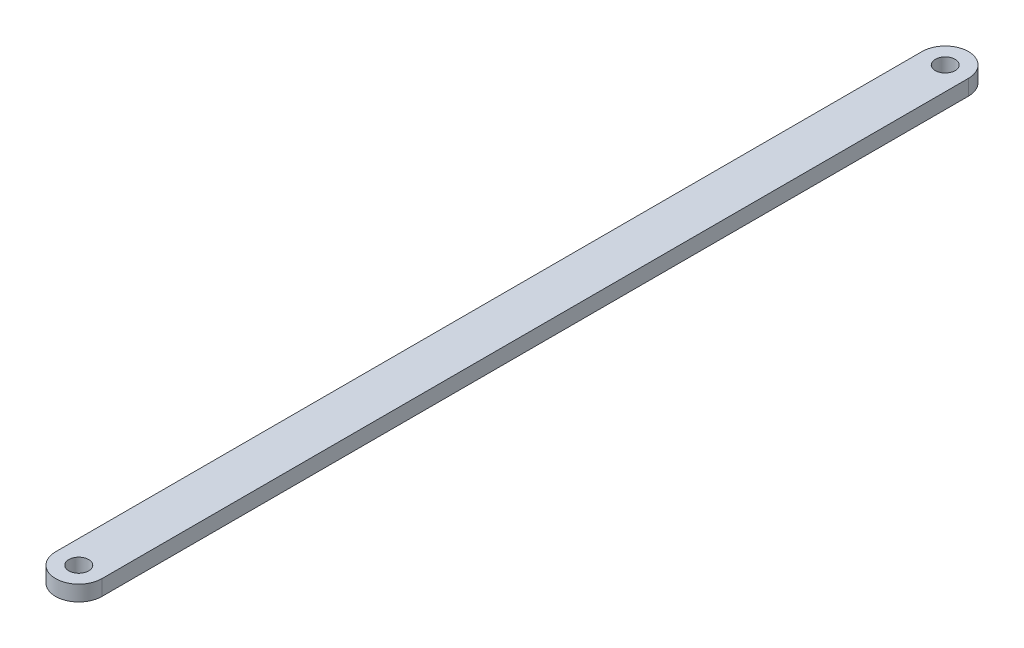
ISO-10303-21;
HEADER;
FILE_DESCRIPTION(('STEP AP214'),'2;1');
FILE_NAME('part.step','',(''),(''),'','','');
FILE_SCHEMA(('AUTOMOTIVE_DESIGN { 1 0 10303 214 1 1 1 1 }'));
ENDSEC;
DATA;
#1=APPLICATION_CONTEXT('core data for automotive mechanical design processes');
#2=APPLICATION_PROTOCOL_DEFINITION('international standard','automotive_design',2000,#1);
#3=PRODUCT_CONTEXT('',#1,'mechanical');
#4=PRODUCT('Part','Part','',(#3));
#5=PRODUCT_RELATED_PRODUCT_CATEGORY('part','',(#4));
#6=PRODUCT_DEFINITION_FORMATION('','',#4);
#7=PRODUCT_DEFINITION_CONTEXT('part definition',#1,'design');
#8=PRODUCT_DEFINITION('design','',#6,#7);
#9=PRODUCT_DEFINITION_SHAPE('','',#8);
#10=(LENGTH_UNIT() NAMED_UNIT(*) SI_UNIT(.MILLI.,.METRE.));
#11=(NAMED_UNIT(*) PLANE_ANGLE_UNIT() SI_UNIT($,.RADIAN.));
#12=(NAMED_UNIT(*) SI_UNIT($,.STERADIAN.) SOLID_ANGLE_UNIT());
#13=UNCERTAINTY_MEASURE_WITH_UNIT(LENGTH_MEASURE(1.E-05),#10,'distance_accuracy_value','');
#14=(GEOMETRIC_REPRESENTATION_CONTEXT(3) GLOBAL_UNCERTAINTY_ASSIGNED_CONTEXT((#13)) GLOBAL_UNIT_ASSIGNED_CONTEXT((#10,
#11,#12)) REPRESENTATION_CONTEXT('',''));
#15=CARTESIAN_POINT('',(0.,0.,0.));
#16=DIRECTION('',(0.,0.,1.));
#17=DIRECTION('',(1.,0.,0.));
#18=AXIS2_PLACEMENT_3D('',#15,#16,#17);
#19=CARTESIAN_POINT('',(0.,3.175,0.));
#20=DIRECTION('',(0.,1.,0.));
#21=DIRECTION('',(0.,0.,1.));
#22=AXIS2_PLACEMENT_3D('',#19,#20,#21);
#23=PLANE('',#22);
#24=CARTESIAN_POINT('',(0.,3.175,-177.8));
#25=DIRECTION('',(0.,1.,0.));
#26=DIRECTION('',(0.,0.,1.));
#27=AXIS2_PLACEMENT_3D('',#24,#25,#26);
#28=CIRCLE('',#27,2.03199999999999);
#29=CARTESIAN_POINT('',(0.,3.175,-175.768));
#30=VERTEX_POINT('',#29);
#31=EDGE_CURVE('E120',#30,#30,#28,.T.);
#32=ORIENTED_EDGE('',*,*,#31,.F.);
#33=EDGE_LOOP('',(#32));
#34=FACE_BOUND('',#33,.T.);
#35=CARTESIAN_POINT('',(0.,3.175,0.));
#36=DIRECTION('',(0.,1.,0.));
#37=DIRECTION('',(0.,0.,1.));
#38=AXIS2_PLACEMENT_3D('',#35,#36,#37);
#39=CIRCLE('',#38,4.7625);
#40=CARTESIAN_POINT('',(-4.7625,3.175,0.));
#41=VERTEX_POINT('',#40);
#42=CARTESIAN_POINT('',(4.7625,3.175,0.));
#43=VERTEX_POINT('',#42);
#44=EDGE_CURVE('E99',#41,#43,#39,.T.);
#45=ORIENTED_EDGE('',*,*,#44,.T.);
#46=DIRECTION('',(0.,0.,-1.));
#47=VECTOR('',#46,1.);
#48=CARTESIAN_POINT('',(4.7625,3.175,0.));
#49=LINE('',#48,#47);
#50=CARTESIAN_POINT('',(4.7625,3.175,-177.8));
#51=VERTEX_POINT('',#50);
#52=EDGE_CURVE('E94',#43,#51,#49,.T.);
#53=ORIENTED_EDGE('',*,*,#52,.T.);
#54=CARTESIAN_POINT('',(0.,3.175,-177.8));
#55=DIRECTION('',(0.,1.,0.));
#56=DIRECTION('',(0.,0.,1.));
#57=AXIS2_PLACEMENT_3D('',#54,#55,#56);
#58=CIRCLE('',#57,4.7625);
#59=CARTESIAN_POINT('',(-4.7625,3.175,-177.8));
#60=VERTEX_POINT('',#59);
#61=EDGE_CURVE('E97',#51,#60,#58,.T.);
#62=ORIENTED_EDGE('',*,*,#61,.T.);
#63=DIRECTION('',(0.,0.,1.));
#64=VECTOR('',#63,1.);
#65=CARTESIAN_POINT('',(-4.7625,3.175,0.));
#66=LINE('',#65,#64);
#67=EDGE_CURVE('E60',#60,#41,#66,.T.);
#68=ORIENTED_EDGE('',*,*,#67,.T.);
#69=EDGE_LOOP('',(#45,#53,#62,#68));
#70=FACE_BOUND('',#69,.T.);
#71=CARTESIAN_POINT('',(0.,3.175,0.));
#72=DIRECTION('',(0.,1.,0.));
#73=DIRECTION('',(0.,0.,1.));
#74=AXIS2_PLACEMENT_3D('',#71,#72,#73);
#75=CIRCLE('',#74,2.032);
#76=CARTESIAN_POINT('',(0.,3.175,2.032));
#77=VERTEX_POINT('',#76);
#78=EDGE_CURVE('E138',#77,#77,#75,.T.);
#79=ORIENTED_EDGE('',*,*,#78,.F.);
#80=EDGE_LOOP('',(#79));
#81=FACE_BOUND('',#80,.T.);
#82=ADVANCED_FACE('F43',(#34,#70,#81),#23,.T.);
#83=CARTESIAN_POINT('',(0.,0.,0.));
#84=DIRECTION('',(0.,1.,0.));
#85=DIRECTION('',(0.,0.,1.));
#86=AXIS2_PLACEMENT_3D('',#83,#84,#85);
#87=PLANE('',#86);
#88=CARTESIAN_POINT('',(0.,0.,0.));
#89=DIRECTION('',(0.,1.,0.));
#90=DIRECTION('',(0.,0.,1.));
#91=AXIS2_PLACEMENT_3D('',#88,#89,#90);
#92=CIRCLE('',#91,4.7625);
#93=CARTESIAN_POINT('',(-4.7625,0.,0.));
#94=VERTEX_POINT('',#93);
#95=CARTESIAN_POINT('',(4.7625,0.,0.));
#96=VERTEX_POINT('',#95);
#97=EDGE_CURVE('E117',#94,#96,#92,.T.);
#98=ORIENTED_EDGE('',*,*,#97,.F.);
#99=DIRECTION('',(0.,0.,1.));
#100=VECTOR('',#99,1.);
#101=CARTESIAN_POINT('',(-4.7625,0.,0.));
#102=LINE('',#101,#100);
#103=CARTESIAN_POINT('',(-4.7625,0.,-177.8));
#104=VERTEX_POINT('',#103);
#105=EDGE_CURVE('E87',#104,#94,#102,.T.);
#106=ORIENTED_EDGE('',*,*,#105,.F.);
#107=CARTESIAN_POINT('',(0.,0.,-177.8));
#108=DIRECTION('',(0.,1.,0.));
#109=DIRECTION('',(0.,0.,1.));
#110=AXIS2_PLACEMENT_3D('',#107,#108,#109);
#111=CIRCLE('',#110,4.7625);
#112=CARTESIAN_POINT('',(4.7625,0.,-177.8));
#113=VERTEX_POINT('',#112);
#114=EDGE_CURVE('E81',#113,#104,#111,.T.);
#115=ORIENTED_EDGE('',*,*,#114,.F.);
#116=DIRECTION('',(0.,0.,-1.));
#117=VECTOR('',#116,1.);
#118=CARTESIAN_POINT('',(4.7625,0.,0.));
#119=LINE('',#118,#117);
#120=EDGE_CURVE('E104',#96,#113,#119,.T.);
#121=ORIENTED_EDGE('',*,*,#120,.F.);
#122=EDGE_LOOP('',(#98,#106,#115,#121));
#123=FACE_BOUND('',#122,.T.);
#124=CARTESIAN_POINT('',(0.,0.,-177.8));
#125=DIRECTION('',(0.,1.,0.));
#126=DIRECTION('',(0.,0.,1.));
#127=AXIS2_PLACEMENT_3D('',#124,#125,#126);
#128=CIRCLE('',#127,2.03199999999999);
#129=CARTESIAN_POINT('',(0.,0.,-175.768));
#130=VERTEX_POINT('',#129);
#131=EDGE_CURVE('E134',#130,#130,#128,.T.);
#132=ORIENTED_EDGE('',*,*,#131,.T.);
#133=EDGE_LOOP('',(#132));
#134=FACE_BOUND('',#133,.T.);
#135=CARTESIAN_POINT('',(0.,0.,0.));
#136=DIRECTION('',(0.,1.,0.));
#137=DIRECTION('',(0.,0.,1.));
#138=AXIS2_PLACEMENT_3D('',#135,#136,#137);
#139=CIRCLE('',#138,2.032);
#140=CARTESIAN_POINT('',(0.,0.,2.032));
#141=VERTEX_POINT('',#140);
#142=EDGE_CURVE('E142',#141,#141,#139,.T.);
#143=ORIENTED_EDGE('',*,*,#142,.T.);
#144=EDGE_LOOP('',(#143));
#145=FACE_BOUND('',#144,.T.);
#146=ADVANCED_FACE('F130',(#123,#134,#145),#87,.F.);
#147=CARTESIAN_POINT('',(0.,3.175,0.));
#148=DIRECTION('',(0.,-1.,0.));
#149=DIRECTION('',(0.,0.,-1.));
#150=AXIS2_PLACEMENT_3D('',#147,#148,#149);
#151=CYLINDRICAL_SURFACE('',#150,4.7625);
#152=ORIENTED_EDGE('',*,*,#97,.T.);
#153=DIRECTION('',(0.,-1.,0.));
#154=VECTOR('',#153,1.);
#155=CARTESIAN_POINT('',(4.7625,3.175,0.));
#156=LINE('',#155,#154);
#157=EDGE_CURVE('E11',#43,#96,#156,.T.);
#158=ORIENTED_EDGE('',*,*,#157,.F.);
#159=ORIENTED_EDGE('',*,*,#44,.F.);
#160=DIRECTION('',(0.,-1.,0.));
#161=VECTOR('',#160,1.);
#162=CARTESIAN_POINT('',(-4.7625,3.175,0.));
#163=LINE('',#162,#161);
#164=EDGE_CURVE('E113',#41,#94,#163,.T.);
#165=ORIENTED_EDGE('',*,*,#164,.T.);
#166=EDGE_LOOP('',(#152,#158,#159,#165));
#167=FACE_BOUND('',#166,.T.);
#168=ADVANCED_FACE('F45',(#167),#151,.T.);
#169=CARTESIAN_POINT('',(4.7625,3.175,0.));
#170=DIRECTION('',(-1.,0.,0.));
#171=DIRECTION('',(0.,0.,1.));
#172=AXIS2_PLACEMENT_3D('',#169,#170,#171);
#173=PLANE('',#172);
#174=ORIENTED_EDGE('',*,*,#120,.T.);
#175=DIRECTION('',(0.,-1.,0.));
#176=VECTOR('',#175,1.);
#177=CARTESIAN_POINT('',(4.7625,3.175,-177.8));
#178=LINE('',#177,#176);
#179=EDGE_CURVE('E52',#51,#113,#178,.T.);
#180=ORIENTED_EDGE('',*,*,#179,.F.);
#181=ORIENTED_EDGE('',*,*,#52,.F.);
#182=ORIENTED_EDGE('',*,*,#157,.T.);
#183=EDGE_LOOP('',(#174,#180,#181,#182));
#184=FACE_BOUND('',#183,.T.);
#185=ADVANCED_FACE('F103',(#184),#173,.F.);
#186=CARTESIAN_POINT('',(0.,3.175,-177.8));
#187=DIRECTION('',(0.,-1.,0.));
#188=DIRECTION('',(0.,0.,-1.));
#189=AXIS2_PLACEMENT_3D('',#186,#187,#188);
#190=CYLINDRICAL_SURFACE('',#189,4.7625);
#191=ORIENTED_EDGE('',*,*,#114,.T.);
#192=DIRECTION('',(0.,-1.,0.));
#193=VECTOR('',#192,1.);
#194=CARTESIAN_POINT('',(-4.7625,3.175,-177.8));
#195=LINE('',#194,#193);
#196=EDGE_CURVE('E106',#60,#104,#195,.T.);
#197=ORIENTED_EDGE('',*,*,#196,.F.);
#198=ORIENTED_EDGE('',*,*,#61,.F.);
#199=ORIENTED_EDGE('',*,*,#179,.T.);
#200=EDGE_LOOP('',(#191,#197,#198,#199));
#201=FACE_BOUND('',#200,.T.);
#202=ADVANCED_FACE('F107',(#201),#190,.T.);
#203=CARTESIAN_POINT('',(-4.7625,3.175,0.));
#204=DIRECTION('',(1.,0.,0.));
#205=DIRECTION('',(0.,0.,-1.));
#206=AXIS2_PLACEMENT_3D('',#203,#204,#205);
#207=PLANE('',#206);
#208=ORIENTED_EDGE('',*,*,#105,.T.);
#209=ORIENTED_EDGE('',*,*,#164,.F.);
#210=ORIENTED_EDGE('',*,*,#67,.F.);
#211=ORIENTED_EDGE('',*,*,#196,.T.);
#212=EDGE_LOOP('',(#208,#209,#210,#211));
#213=FACE_BOUND('',#212,.T.);
#214=ADVANCED_FACE('F127',(#213),#207,.F.);
#215=CARTESIAN_POINT('',(0.,3.175,-177.8));
#216=DIRECTION('',(0.,-1.,0.));
#217=DIRECTION('',(0.,0.,-1.));
#218=AXIS2_PLACEMENT_3D('',#215,#216,#217);
#219=CYLINDRICAL_SURFACE('',#218,2.03199999999999);
#220=ORIENTED_EDGE('',*,*,#31,.T.);
#221=EDGE_LOOP('',(#220));
#222=FACE_BOUND('',#221,.T.);
#223=ORIENTED_EDGE('',*,*,#131,.F.);
#224=EDGE_LOOP('',(#223));
#225=FACE_BOUND('',#224,.T.);
#226=ADVANCED_FACE('F158',(#222,#225),#219,.F.);
#227=CARTESIAN_POINT('',(0.,3.175,0.));
#228=DIRECTION('',(0.,-1.,0.));
#229=DIRECTION('',(0.,0.,-1.));
#230=AXIS2_PLACEMENT_3D('',#227,#228,#229);
#231=CYLINDRICAL_SURFACE('',#230,2.032);
#232=ORIENTED_EDGE('',*,*,#78,.T.);
#233=EDGE_LOOP('',(#232));
#234=FACE_BOUND('',#233,.T.);
#235=ORIENTED_EDGE('',*,*,#142,.F.);
#236=EDGE_LOOP('',(#235));
#237=FACE_BOUND('',#236,.T.);
#238=ADVANCED_FACE('F148',(#234,#237),#231,.F.);
#239=CLOSED_SHELL('',(#82,#146,#168,#185,#202,#214,#226,#238));
#240=MANIFOLD_SOLID_BREP('B2',#239);
#241=ADVANCED_BREP_SHAPE_REPRESENTATION('',(#18,#240),#14);
#242=SHAPE_DEFINITION_REPRESENTATION(#9,#241);
ENDSEC;
END-ISO-10303-21;
